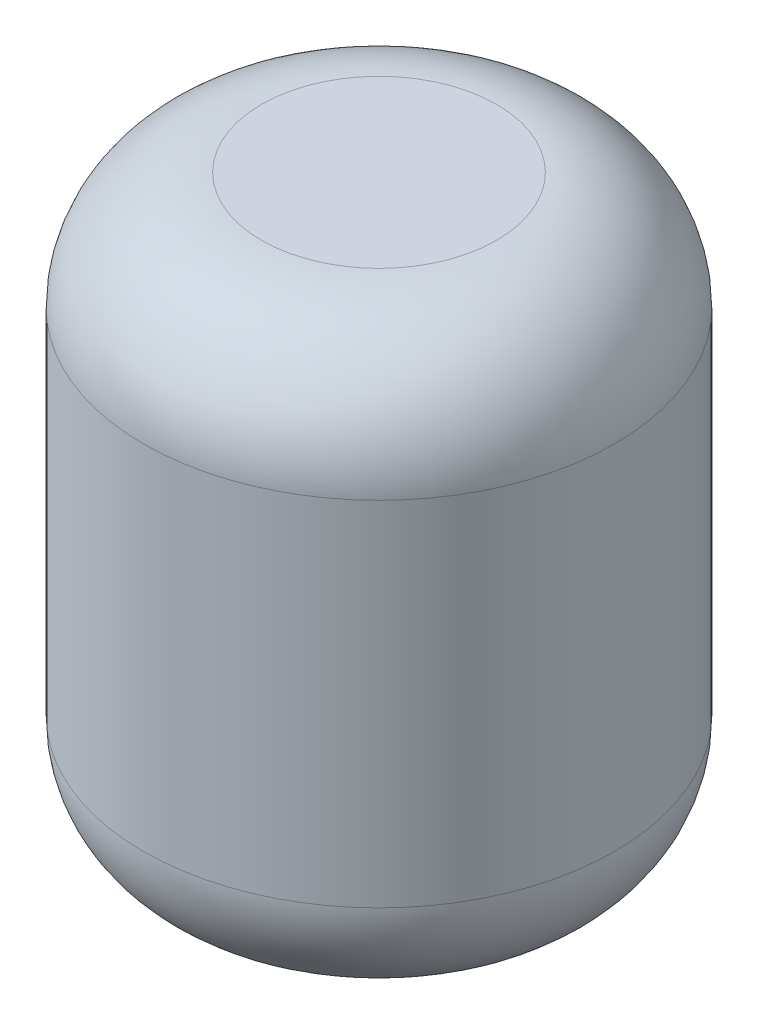
ISO-10303-21;
HEADER;
FILE_DESCRIPTION(('STEP AP214'),'2;1');
FILE_NAME('part.step','',(''),(''),'','','');
FILE_SCHEMA(('AUTOMOTIVE_DESIGN { 1 0 10303 214 1 1 1 1 }'));
ENDSEC;
DATA;
#1=APPLICATION_CONTEXT('core data for automotive mechanical design processes');
#2=APPLICATION_PROTOCOL_DEFINITION('international standard','automotive_design',2000,#1);
#3=PRODUCT_CONTEXT('',#1,'mechanical');
#4=PRODUCT('Part','Part','',(#3));
#5=PRODUCT_RELATED_PRODUCT_CATEGORY('part','',(#4));
#6=PRODUCT_DEFINITION_FORMATION('','',#4);
#7=PRODUCT_DEFINITION_CONTEXT('part definition',#1,'design');
#8=PRODUCT_DEFINITION('design','',#6,#7);
#9=PRODUCT_DEFINITION_SHAPE('','',#8);
#10=(LENGTH_UNIT() NAMED_UNIT(*) SI_UNIT(.MILLI.,.METRE.));
#11=(NAMED_UNIT(*) PLANE_ANGLE_UNIT() SI_UNIT($,.RADIAN.));
#12=(NAMED_UNIT(*) SI_UNIT($,.STERADIAN.) SOLID_ANGLE_UNIT());
#13=UNCERTAINTY_MEASURE_WITH_UNIT(LENGTH_MEASURE(1.E-05),#10,'distance_accuracy_value','');
#14=(GEOMETRIC_REPRESENTATION_CONTEXT(3) GLOBAL_UNCERTAINTY_ASSIGNED_CONTEXT((#13)) GLOBAL_UNIT_ASSIGNED_CONTEXT((#10,
#11,#12)) REPRESENTATION_CONTEXT('',''));
#15=CARTESIAN_POINT('',(0.,0.,0.));
#16=DIRECTION('',(0.,0.,1.));
#17=DIRECTION('',(1.,0.,0.));
#18=AXIS2_PLACEMENT_3D('',#15,#16,#17);
#19=CARTESIAN_POINT('',(0.,127.,0.));
#20=DIRECTION('',(0.,-1.,0.));
#21=DIRECTION('',(0.,0.,-1.));
#22=AXIS2_PLACEMENT_3D('',#19,#20,#21);
#23=CYLINDRICAL_SURFACE('',#22,50.8);
#24=CARTESIAN_POINT('',(0.,25.4,0.));
#25=DIRECTION('',(0.,1.,0.));
#26=DIRECTION('',(0.,0.,1.));
#27=AXIS2_PLACEMENT_3D('',#24,#25,#26);
#28=CIRCLE('',#27,50.8);
#29=CARTESIAN_POINT('',(0.,25.4,50.8));
#30=VERTEX_POINT('',#29);
#31=EDGE_CURVE('E45',#30,#30,#28,.T.);
#32=ORIENTED_EDGE('',*,*,#31,.T.);
#33=EDGE_LOOP('',(#32));
#34=FACE_BOUND('',#33,.T.);
#35=CARTESIAN_POINT('',(0.,101.6,0.));
#36=DIRECTION('',(0.,1.,0.));
#37=DIRECTION('',(0.,0.,1.));
#38=AXIS2_PLACEMENT_3D('',#35,#36,#37);
#39=CIRCLE('',#38,50.8);
#40=CARTESIAN_POINT('',(0.,101.6,50.8));
#41=VERTEX_POINT('',#40);
#42=EDGE_CURVE('E50',#41,#41,#39,.F.);
#43=ORIENTED_EDGE('',*,*,#42,.T.);
#44=EDGE_LOOP('',(#43));
#45=FACE_BOUND('',#44,.T.);
#46=ADVANCED_FACE('F37',(#34,#45),#23,.T.);
#47=CARTESIAN_POINT('',(0.,127.,0.));
#48=DIRECTION('',(0.,1.,0.));
#49=DIRECTION('',(0.,0.,1.));
#50=AXIS2_PLACEMENT_3D('',#47,#48,#49);
#51=PLANE('',#50);
#52=CARTESIAN_POINT('',(0.,127.,0.));
#53=DIRECTION('',(0.,1.,0.));
#54=DIRECTION('',(0.,0.,1.));
#55=AXIS2_PLACEMENT_3D('',#52,#53,#54);
#56=CIRCLE('',#55,25.4);
#57=CARTESIAN_POINT('',(0.,127.,25.4));
#58=VERTEX_POINT('',#57);
#59=EDGE_CURVE('E55',#58,#58,#56,.T.);
#60=ORIENTED_EDGE('',*,*,#59,.T.);
#61=EDGE_LOOP('',(#60));
#62=FACE_BOUND('',#61,.T.);
#63=ADVANCED_FACE('F62',(#62),#51,.T.);
#64=CARTESIAN_POINT('',(0.,0.,0.));
#65=DIRECTION('',(0.,1.,0.));
#66=DIRECTION('',(0.,0.,1.));
#67=AXIS2_PLACEMENT_3D('',#64,#65,#66);
#68=PLANE('',#67);
#69=CARTESIAN_POINT('',(0.,0.,0.));
#70=DIRECTION('',(0.,1.,0.));
#71=DIRECTION('',(0.,0.,1.));
#72=AXIS2_PLACEMENT_3D('',#69,#70,#71);
#73=CIRCLE('',#72,25.4);
#74=CARTESIAN_POINT('',(0.,0.,25.4));
#75=VERTEX_POINT('',#74);
#76=EDGE_CURVE('E10',#75,#75,#73,.F.);
#77=ORIENTED_EDGE('',*,*,#76,.T.);
#78=EDGE_LOOP('',(#77));
#79=FACE_BOUND('',#78,.T.);
#80=ADVANCED_FACE('F66',(#79),#68,.F.);
#81=CARTESIAN_POINT('',(0.,101.6,0.));
#82=DIRECTION('',(0.,1.,0.));
#83=DIRECTION('',(0.,0.,1.));
#84=AXIS2_PLACEMENT_3D('',#81,#82,#83);
#85=DEGENERATE_TOROIDAL_SURFACE('',#84,25.4,25.4,.T.);
#86=ORIENTED_EDGE('',*,*,#42,.F.);
#87=EDGE_LOOP('',(#86));
#88=FACE_BOUND('',#87,.T.);
#89=ORIENTED_EDGE('',*,*,#59,.F.);
#90=EDGE_LOOP('',(#89));
#91=FACE_BOUND('',#90,.T.);
#92=ADVANCED_FACE('F64',(#88,#91),#85,.T.);
#93=CARTESIAN_POINT('',(0.,25.4,0.));
#94=DIRECTION('',(0.,1.,0.));
#95=DIRECTION('',(0.,0.,1.));
#96=AXIS2_PLACEMENT_3D('',#93,#94,#95);
#97=DEGENERATE_TOROIDAL_SURFACE('',#96,25.4,25.4,.T.);
#98=ORIENTED_EDGE('',*,*,#76,.F.);
#99=EDGE_LOOP('',(#98));
#100=FACE_BOUND('',#99,.T.);
#101=ORIENTED_EDGE('',*,*,#31,.F.);
#102=EDGE_LOOP('',(#101));
#103=FACE_BOUND('',#102,.T.);
#104=ADVANCED_FACE('F39',(#100,#103),#97,.T.);
#105=CLOSED_SHELL('',(#46,#63,#80,#92,#104));
#106=MANIFOLD_SOLID_BREP('B2',#105);
#107=ADVANCED_BREP_SHAPE_REPRESENTATION('',(#18,#106),#14);
#108=SHAPE_DEFINITION_REPRESENTATION(#9,#107);
ENDSEC;
END-ISO-10303-21;
